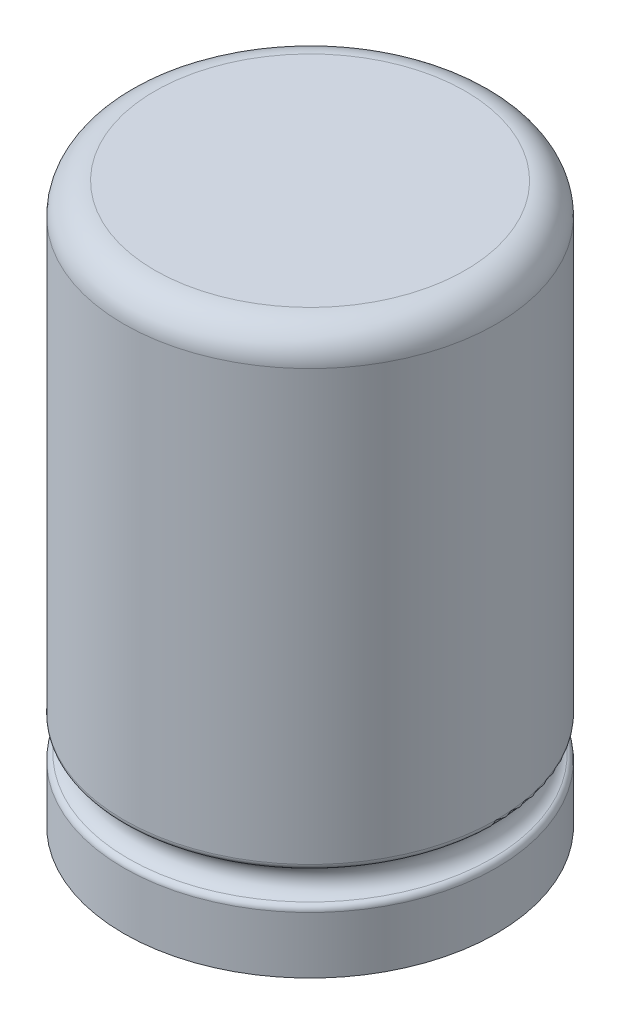
ISO-10303-21;
HEADER;
FILE_DESCRIPTION(('STEP AP214'),'2;1');
FILE_NAME('part.step','',(''),(''),'','','');
FILE_SCHEMA(('AUTOMOTIVE_DESIGN { 1 0 10303 214 1 1 1 1 }'));
ENDSEC;
DATA;
#1=APPLICATION_CONTEXT('core data for automotive mechanical design processes');
#2=APPLICATION_PROTOCOL_DEFINITION('international standard','automotive_design',2000,#1);
#3=PRODUCT_CONTEXT('',#1,'mechanical');
#4=PRODUCT('Part','Part','',(#3));
#5=PRODUCT_RELATED_PRODUCT_CATEGORY('part','',(#4));
#6=PRODUCT_DEFINITION_FORMATION('','',#4);
#7=PRODUCT_DEFINITION_CONTEXT('part definition',#1,'design');
#8=PRODUCT_DEFINITION('design','',#6,#7);
#9=PRODUCT_DEFINITION_SHAPE('','',#8);
#10=(LENGTH_UNIT() NAMED_UNIT(*) SI_UNIT(.MILLI.,.METRE.));
#11=(NAMED_UNIT(*) PLANE_ANGLE_UNIT() SI_UNIT($,.RADIAN.));
#12=(NAMED_UNIT(*) SI_UNIT($,.STERADIAN.) SOLID_ANGLE_UNIT());
#13=UNCERTAINTY_MEASURE_WITH_UNIT(LENGTH_MEASURE(1.E-05),#10,'distance_accuracy_value','');
#14=(GEOMETRIC_REPRESENTATION_CONTEXT(3) GLOBAL_UNCERTAINTY_ASSIGNED_CONTEXT((#13)) GLOBAL_UNIT_ASSIGNED_CONTEXT((#10,
#11,#12)) REPRESENTATION_CONTEXT('',''));
#15=CARTESIAN_POINT('',(0.,0.,0.));
#16=DIRECTION('',(0.,0.,1.));
#17=DIRECTION('',(1.,0.,0.));
#18=AXIS2_PLACEMENT_3D('',#15,#16,#17);
#19=CARTESIAN_POINT('',(0.,0.,0.));
#20=DIRECTION('',(0.,-1.,0.));
#21=DIRECTION('',(0.,0.,-1.));
#22=AXIS2_PLACEMENT_3D('',#19,#20,#21);
#23=PLANE('',#22);
#24=CARTESIAN_POINT('',(0.,0.,0.));
#25=DIRECTION('',(0.,-1.,0.));
#26=DIRECTION('',(0.,0.,-1.));
#27=AXIS2_PLACEMENT_3D('',#24,#25,#26);
#28=CIRCLE('',#27,3.);
#29=CARTESIAN_POINT('',(0.,0.,-3.));
#30=VERTEX_POINT('',#29);
#31=EDGE_CURVE('E51',#30,#30,#28,.T.);
#32=ORIENTED_EDGE('',*,*,#31,.T.);
#33=EDGE_LOOP('',(#32));
#34=FACE_BOUND('',#33,.T.);
#35=ADVANCED_FACE('F31',(#34),#23,.T.);
#36=CARTESIAN_POINT('',(0.,-5.13037655750242,0.));
#37=DIRECTION('',(0.,-1.,0.));
#38=DIRECTION('',(0.,0.,-1.));
#39=AXIS2_PLACEMENT_3D('',#36,#37,#38);
#40=CYLINDRICAL_SURFACE('',#39,3.);
#41=CARTESIAN_POINT('',(0.,0.914589803375032,0.));
#42=DIRECTION('',(0.,1.,0.));
#43=DIRECTION('',(0.,0.,1.));
#44=AXIS2_PLACEMENT_3D('',#41,#42,#43);
#45=CIRCLE('',#44,3.);
#46=CARTESIAN_POINT('',(0.,0.914589803375032,3.));
#47=VERTEX_POINT('',#46);
#48=EDGE_CURVE('E10',#47,#47,#45,.F.);
#49=ORIENTED_EDGE('',*,*,#48,.T.);
#50=EDGE_LOOP('',(#49));
#51=FACE_BOUND('',#50,.T.);
#52=ORIENTED_EDGE('',*,*,#31,.F.);
#53=EDGE_LOOP('',(#52));
#54=FACE_BOUND('',#53,.T.);
#55=ADVANCED_FACE('F76',(#51,#54),#40,.T.);
#56=CARTESIAN_POINT('',(0.,1.25,0.));
#57=DIRECTION('',(0.,-1.,0.));
#58=DIRECTION('',(0.,0.,-1.));
#59=AXIS2_PLACEMENT_3D('',#56,#57,#58);
#60=TOROIDAL_SURFACE('',#59,3.,0.25);
#61=CARTESIAN_POINT('',(0.,1.48957871187503,0.));
#62=DIRECTION('',(0.,-1.,0.));
#63=DIRECTION('',(0.,0.,-1.));
#64=AXIS2_PLACEMENT_3D('',#61,#62,#63);
#65=CIRCLE('',#64,2.92857142857141);
#66=CARTESIAN_POINT('',(0.,1.48957871187503,-2.92857142857141));
#67=VERTEX_POINT('',#66);
#68=EDGE_CURVE('E42',#67,#67,#65,.T.);
#69=ORIENTED_EDGE('',*,*,#68,.T.);
#70=EDGE_LOOP('',(#69));
#71=FACE_BOUND('',#70,.T.);
#72=CARTESIAN_POINT('',(0.,1.01042128812497,0.));
#73=DIRECTION('',(0.,1.,0.));
#74=DIRECTION('',(0.,0.,1.));
#75=AXIS2_PLACEMENT_3D('',#72,#73,#74);
#76=CIRCLE('',#75,2.92857142857141);
#77=CARTESIAN_POINT('',(0.,1.01042128812497,2.92857142857141));
#78=VERTEX_POINT('',#77);
#79=EDGE_CURVE('E46',#78,#78,#76,.T.);
#80=ORIENTED_EDGE('',*,*,#79,.T.);
#81=EDGE_LOOP('',(#80));
#82=FACE_BOUND('',#81,.T.);
#83=ADVANCED_FACE('F82',(#71,#82),#60,.F.);
#84=CARTESIAN_POINT('',(0.,-5.13037655750242,0.));
#85=DIRECTION('',(0.,-1.,0.));
#86=DIRECTION('',(0.,0.,-1.));
#87=AXIS2_PLACEMENT_3D('',#84,#85,#86);
#88=CYLINDRICAL_SURFACE('',#87,3.);
#89=CARTESIAN_POINT('',(0.,1.58541019662497,0.));
#90=DIRECTION('',(0.,1.,0.));
#91=DIRECTION('',(0.,0.,1.));
#92=AXIS2_PLACEMENT_3D('',#89,#90,#91);
#93=CIRCLE('',#92,3.);
#94=CARTESIAN_POINT('',(0.,1.58541019662497,3.));
#95=VERTEX_POINT('',#94);
#96=EDGE_CURVE('E38',#95,#95,#93,.T.);
#97=ORIENTED_EDGE('',*,*,#96,.T.);
#98=EDGE_LOOP('',(#97));
#99=FACE_BOUND('',#98,.T.);
#100=CARTESIAN_POINT('',(0.,8.5,0.));
#101=DIRECTION('',(0.,-1.,0.));
#102=DIRECTION('',(0.,0.,-1.));
#103=AXIS2_PLACEMENT_3D('',#100,#101,#102);
#104=CIRCLE('',#103,3.);
#105=CARTESIAN_POINT('',(0.,8.5,-3.));
#106=VERTEX_POINT('',#105);
#107=EDGE_CURVE('E54',#106,#106,#104,.T.);
#108=ORIENTED_EDGE('',*,*,#107,.T.);
#109=EDGE_LOOP('',(#108));
#110=FACE_BOUND('',#109,.T.);
#111=ADVANCED_FACE('F73',(#99,#110),#88,.T.);
#112=CARTESIAN_POINT('',(0.,8.5,0.));
#113=DIRECTION('',(0.,-1.,0.));
#114=DIRECTION('',(0.,0.,-1.));
#115=AXIS2_PLACEMENT_3D('',#112,#113,#114);
#116=TOROIDAL_SURFACE('',#115,2.5,0.5);
#117=CARTESIAN_POINT('',(0.,9.,0.));
#118=DIRECTION('',(0.,-1.,0.));
#119=DIRECTION('',(0.,0.,-1.));
#120=AXIS2_PLACEMENT_3D('',#117,#118,#119);
#121=CIRCLE('',#120,2.5);
#122=CARTESIAN_POINT('',(0.,9.,-2.5));
#123=VERTEX_POINT('',#122);
#124=EDGE_CURVE('E57',#123,#123,#121,.T.);
#125=ORIENTED_EDGE('',*,*,#124,.T.);
#126=EDGE_LOOP('',(#125));
#127=FACE_BOUND('',#126,.T.);
#128=ORIENTED_EDGE('',*,*,#107,.F.);
#129=EDGE_LOOP('',(#128));
#130=FACE_BOUND('',#129,.T.);
#131=ADVANCED_FACE('F61',(#127,#130),#116,.T.);
#132=CARTESIAN_POINT('',(2.5,9.,0.));
#133=DIRECTION('',(0.,1.,0.));
#134=DIRECTION('',(0.,0.,1.));
#135=AXIS2_PLACEMENT_3D('',#132,#133,#134);
#136=PLANE('',#135);
#137=ORIENTED_EDGE('',*,*,#124,.F.);
#138=EDGE_LOOP('',(#137));
#139=FACE_BOUND('',#138,.T.);
#140=ADVANCED_FACE('F64',(#139),#136,.T.);
#141=CARTESIAN_POINT('',(0.,1.58541019662497,0.));
#142=DIRECTION('',(0.,1.,0.));
#143=DIRECTION('',(0.,0.,1.));
#144=AXIS2_PLACEMENT_3D('',#141,#142,#143);
#145=TOROIDAL_SURFACE('',#144,2.9,0.1);
#146=ORIENTED_EDGE('',*,*,#96,.F.);
#147=EDGE_LOOP('',(#146));
#148=FACE_BOUND('',#147,.T.);
#149=ORIENTED_EDGE('',*,*,#68,.F.);
#150=EDGE_LOOP('',(#149));
#151=FACE_BOUND('',#150,.T.);
#152=ADVANCED_FACE('F66',(#148,#151),#145,.T.);
#153=CARTESIAN_POINT('',(0.,0.914589803375032,0.));
#154=DIRECTION('',(0.,1.,0.));
#155=DIRECTION('',(0.,0.,1.));
#156=AXIS2_PLACEMENT_3D('',#153,#154,#155);
#157=TOROIDAL_SURFACE('',#156,2.9,0.1);
#158=ORIENTED_EDGE('',*,*,#79,.F.);
#159=EDGE_LOOP('',(#158));
#160=FACE_BOUND('',#159,.T.);
#161=ORIENTED_EDGE('',*,*,#48,.F.);
#162=EDGE_LOOP('',(#161));
#163=FACE_BOUND('',#162,.T.);
#164=ADVANCED_FACE('F33',(#160,#163),#157,.T.);
#165=CLOSED_SHELL('',(#35,#55,#83,#111,#131,#140,#152,#164));
#166=MANIFOLD_SOLID_BREP('B2',#165);
#167=ADVANCED_BREP_SHAPE_REPRESENTATION('',(#18,#166),#14);
#168=SHAPE_DEFINITION_REPRESENTATION(#9,#167);
ENDSEC;
END-ISO-10303-21;
